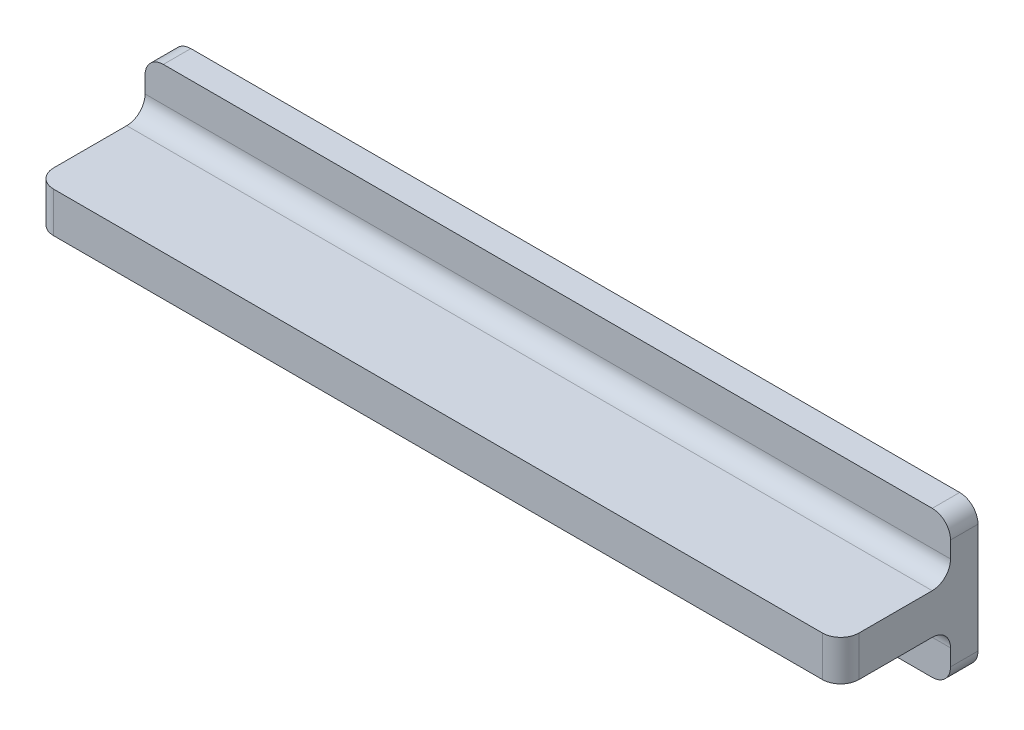
ISO-10303-21;
HEADER;
FILE_DESCRIPTION(('STEP AP214'),'2;1');
FILE_NAME('part.step','',(''),(''),'','','');
FILE_SCHEMA(('AUTOMOTIVE_DESIGN { 1 0 10303 214 1 1 1 1 }'));
ENDSEC;
DATA;
#1=APPLICATION_CONTEXT('core data for automotive mechanical design processes');
#2=APPLICATION_PROTOCOL_DEFINITION('international standard','automotive_design',2000,#1);
#3=PRODUCT_CONTEXT('',#1,'mechanical');
#4=PRODUCT('Part','Part','',(#3));
#5=PRODUCT_RELATED_PRODUCT_CATEGORY('part','',(#4));
#6=PRODUCT_DEFINITION_FORMATION('','',#4);
#7=PRODUCT_DEFINITION_CONTEXT('part definition',#1,'design');
#8=PRODUCT_DEFINITION('design','',#6,#7);
#9=PRODUCT_DEFINITION_SHAPE('','',#8);
#10=(LENGTH_UNIT() NAMED_UNIT(*) SI_UNIT(.MILLI.,.METRE.));
#11=(NAMED_UNIT(*) PLANE_ANGLE_UNIT() SI_UNIT($,.RADIAN.));
#12=(NAMED_UNIT(*) SI_UNIT($,.STERADIAN.) SOLID_ANGLE_UNIT());
#13=UNCERTAINTY_MEASURE_WITH_UNIT(LENGTH_MEASURE(1.E-05),#10,'distance_accuracy_value','');
#14=(GEOMETRIC_REPRESENTATION_CONTEXT(3) GLOBAL_UNCERTAINTY_ASSIGNED_CONTEXT((#13)) GLOBAL_UNIT_ASSIGNED_CONTEXT((#10,
#11,#12)) REPRESENTATION_CONTEXT('',''));
#15=CARTESIAN_POINT('',(0.,0.,0.));
#16=DIRECTION('',(0.,0.,1.));
#17=DIRECTION('',(1.,0.,0.));
#18=AXIS2_PLACEMENT_3D('',#15,#16,#17);
#19=CARTESIAN_POINT('',(0.,0.,4.7625));
#20=DIRECTION('',(0.,0.,1.));
#21=DIRECTION('',(1.,0.,0.));
#22=AXIS2_PLACEMENT_3D('',#19,#20,#21);
#23=PLANE('',#22);
#24=DIRECTION('',(0.,1.,0.));
#25=VECTOR('',#24,1.);
#26=CARTESIAN_POINT('',(69.85,12.7,4.7625));
#27=LINE('',#26,#25);
#28=CARTESIAN_POINT('',(69.85,-9.525,4.7625));
#29=VERTEX_POINT('',#28);
#30=CARTESIAN_POINT('',(69.85,-6.675,4.7625));
#31=VERTEX_POINT('',#30);
#32=EDGE_CURVE('E280',#29,#31,#27,.T.);
#33=ORIENTED_EDGE('',*,*,#32,.T.);
#34=DIRECTION('',(1.,0.,0.));
#35=VECTOR('',#34,1.);
#36=CARTESIAN_POINT('',(0.,-6.675,4.7625));
#37=LINE('',#36,#35);
#38=CARTESIAN_POINT('',(-69.85,-6.675,4.7625));
#39=VERTEX_POINT('',#38);
#40=EDGE_CURVE('E221',#31,#39,#37,.F.);
#41=ORIENTED_EDGE('',*,*,#40,.T.);
#42=DIRECTION('',(0.,-1.,0.));
#43=VECTOR('',#42,1.);
#44=CARTESIAN_POINT('',(-69.85,12.7,4.7625));
#45=LINE('',#44,#43);
#46=CARTESIAN_POINT('',(-69.85,-9.525,4.7625));
#47=VERTEX_POINT('',#46);
#48=EDGE_CURVE('E298',#39,#47,#45,.T.);
#49=ORIENTED_EDGE('',*,*,#48,.T.);
#50=CARTESIAN_POINT('',(-66.675,-9.525,4.7625));
#51=DIRECTION('',(0.,0.,1.));
#52=DIRECTION('',(1.,0.,0.));
#53=AXIS2_PLACEMENT_3D('',#50,#51,#52);
#54=CIRCLE('',#53,3.175);
#55=CARTESIAN_POINT('',(-66.675,-12.7,4.7625));
#56=VERTEX_POINT('',#55);
#57=EDGE_CURVE('E215',#47,#56,#54,.T.);
#58=ORIENTED_EDGE('',*,*,#57,.T.);
#59=DIRECTION('',(1.,0.,0.));
#60=VECTOR('',#59,1.);
#61=CARTESIAN_POINT('',(-69.85,-12.7,4.7625));
#62=LINE('',#61,#60);
#63=CARTESIAN_POINT('',(66.675,-12.7,4.7625));
#64=VERTEX_POINT('',#63);
#65=EDGE_CURVE('E193',#56,#64,#62,.T.);
#66=ORIENTED_EDGE('',*,*,#65,.T.);
#67=CARTESIAN_POINT('',(66.675,-9.525,4.7625));
#68=DIRECTION('',(0.,0.,1.));
#69=DIRECTION('',(1.,0.,0.));
#70=AXIS2_PLACEMENT_3D('',#67,#68,#69);
#71=CIRCLE('',#70,3.175);
#72=EDGE_CURVE('E218',#64,#29,#71,.T.);
#73=ORIENTED_EDGE('',*,*,#72,.T.);
#74=EDGE_LOOP('',(#33,#41,#49,#58,#66,#73));
#75=FACE_BOUND('',#74,.T.);
#76=ADVANCED_FACE('F42',(#75),#23,.T.);
#77=CARTESIAN_POINT('',(69.85,12.7,4.7625));
#78=DIRECTION('',(-1.,0.,0.));
#79=DIRECTION('',(0.,0.,1.));
#80=AXIS2_PLACEMENT_3D('',#77,#78,#79);
#81=PLANE('',#80);
#82=DIRECTION('',(0.,0.,-1.));
#83=VECTOR('',#82,1.);
#84=CARTESIAN_POINT('',(69.85,3.5,23.8125));
#85=LINE('',#84,#83);
#86=CARTESIAN_POINT('',(69.85,3.5,20.6375));
#87=VERTEX_POINT('',#86);
#88=CARTESIAN_POINT('',(69.85,3.5,7.93750000000001));
#89=VERTEX_POINT('',#88);
#90=EDGE_CURVE('E180',#87,#89,#85,.T.);
#91=ORIENTED_EDGE('',*,*,#90,.F.);
#92=DIRECTION('',(0.,1.,0.));
#93=VECTOR('',#92,1.);
#94=CARTESIAN_POINT('',(69.85,-3.5,20.6375));
#95=LINE('',#94,#93);
#96=CARTESIAN_POINT('',(69.85,-3.5,20.6375));
#97=VERTEX_POINT('',#96);
#98=EDGE_CURVE('E242',#87,#97,#95,.F.);
#99=ORIENTED_EDGE('',*,*,#98,.T.);
#100=DIRECTION('',(0.,0.,-1.));
#101=VECTOR('',#100,1.);
#102=CARTESIAN_POINT('',(69.85,-3.5,23.8125));
#103=LINE('',#102,#101);
#104=CARTESIAN_POINT('',(69.85,-3.5,7.93750000000001));
#105=VERTEX_POINT('',#104);
#106=EDGE_CURVE('E283',#97,#105,#103,.T.);
#107=ORIENTED_EDGE('',*,*,#106,.T.);
#108=CARTESIAN_POINT('',(69.85,-6.675,7.9375));
#109=DIRECTION('',(-1.,0.,0.));
#110=DIRECTION('',(0.,0.,1.));
#111=AXIS2_PLACEMENT_3D('',#108,#109,#110);
#112=CIRCLE('',#111,3.175);
#113=EDGE_CURVE('E51',#105,#31,#112,.T.);
#114=ORIENTED_EDGE('',*,*,#113,.T.);
#115=ORIENTED_EDGE('',*,*,#32,.F.);
#116=DIRECTION('',(0.,0.,-1.));
#117=VECTOR('',#116,1.);
#118=CARTESIAN_POINT('',(69.85,-9.525,4.7625));
#119=LINE('',#118,#117);
#120=CARTESIAN_POINT('',(69.85,-9.525,0.));
#121=VERTEX_POINT('',#120);
#122=EDGE_CURVE('E167',#29,#121,#119,.T.);
#123=ORIENTED_EDGE('',*,*,#122,.T.);
#124=DIRECTION('',(0.,1.,0.));
#125=VECTOR('',#124,1.);
#126=CARTESIAN_POINT('',(69.85,12.7,0.));
#127=LINE('',#126,#125);
#128=CARTESIAN_POINT('',(69.85,9.525,0.));
#129=VERTEX_POINT('',#128);
#130=EDGE_CURVE('E310',#121,#129,#127,.T.);
#131=ORIENTED_EDGE('',*,*,#130,.T.);
#132=DIRECTION('',(0.,0.,-1.));
#133=VECTOR('',#132,1.);
#134=CARTESIAN_POINT('',(69.85,9.525,4.7625));
#135=LINE('',#134,#133);
#136=CARTESIAN_POINT('',(69.85,9.525,4.7625));
#137=VERTEX_POINT('',#136);
#138=EDGE_CURVE('E239',#129,#137,#135,.F.);
#139=ORIENTED_EDGE('',*,*,#138,.T.);
#140=CARTESIAN_POINT('',(69.85,6.675,4.7625));
#141=VERTEX_POINT('',#140);
#142=EDGE_CURVE('E294',#141,#137,#27,.T.);
#143=ORIENTED_EDGE('',*,*,#142,.F.);
#144=CARTESIAN_POINT('',(69.85,6.675,7.9375));
#145=DIRECTION('',(-1.,0.,0.));
#146=DIRECTION('',(0.,0.,1.));
#147=AXIS2_PLACEMENT_3D('',#144,#145,#146);
#148=CIRCLE('',#147,3.175);
#149=EDGE_CURVE('E271',#141,#89,#148,.T.);
#150=ORIENTED_EDGE('',*,*,#149,.T.);
#151=EDGE_LOOP('',(#91,#99,#107,#114,#115,#123,#131,#139,#143,#150));
#152=FACE_BOUND('',#151,.T.);
#153=ADVANCED_FACE('F279',(#152),#81,.F.);
#154=CARTESIAN_POINT('',(-69.85,12.7,4.7625));
#155=DIRECTION('',(0.,-1.,0.));
#156=DIRECTION('',(0.,0.,-1.));
#157=AXIS2_PLACEMENT_3D('',#154,#155,#156);
#158=PLANE('',#157);
#159=DIRECTION('',(-1.,0.,0.));
#160=VECTOR('',#159,1.);
#161=CARTESIAN_POINT('',(-69.85,12.7,4.7625));
#162=LINE('',#161,#160);
#163=CARTESIAN_POINT('',(66.675,12.7,4.7625));
#164=VERTEX_POINT('',#163);
#165=CARTESIAN_POINT('',(-66.675,12.7,4.7625));
#166=VERTEX_POINT('',#165);
#167=EDGE_CURVE('E293',#164,#166,#162,.T.);
#168=ORIENTED_EDGE('',*,*,#167,.F.);
#169=DIRECTION('',(0.,0.,-1.));
#170=VECTOR('',#169,1.);
#171=CARTESIAN_POINT('',(66.675,12.7,4.7625));
#172=LINE('',#171,#170);
#173=CARTESIAN_POINT('',(66.675,12.7,0.));
#174=VERTEX_POINT('',#173);
#175=EDGE_CURVE('E248',#164,#174,#172,.T.);
#176=ORIENTED_EDGE('',*,*,#175,.T.);
#177=DIRECTION('',(-1.,0.,0.));
#178=VECTOR('',#177,1.);
#179=CARTESIAN_POINT('',(-69.85,12.7,0.));
#180=LINE('',#179,#178);
#181=CARTESIAN_POINT('',(-66.675,12.7,0.));
#182=VERTEX_POINT('',#181);
#183=EDGE_CURVE('E323',#174,#182,#180,.T.);
#184=ORIENTED_EDGE('',*,*,#183,.T.);
#185=DIRECTION('',(0.,0.,-1.));
#186=VECTOR('',#185,1.);
#187=CARTESIAN_POINT('',(-66.675,12.7,4.7625));
#188=LINE('',#187,#186);
#189=EDGE_CURVE('E245',#182,#166,#188,.F.);
#190=ORIENTED_EDGE('',*,*,#189,.T.);
#191=EDGE_LOOP('',(#168,#176,#184,#190));
#192=FACE_BOUND('',#191,.T.);
#193=ADVANCED_FACE('F350',(#192),#158,.F.);
#194=CARTESIAN_POINT('',(-69.85,12.7,4.7625));
#195=DIRECTION('',(1.,0.,0.));
#196=DIRECTION('',(0.,0.,-1.));
#197=AXIS2_PLACEMENT_3D('',#194,#195,#196);
#198=PLANE('',#197);
#199=DIRECTION('',(0.,0.,-1.));
#200=VECTOR('',#199,1.);
#201=CARTESIAN_POINT('',(-69.85,-3.5,23.8125));
#202=LINE('',#201,#200);
#203=CARTESIAN_POINT('',(-69.85,-3.5,20.6375));
#204=VERTEX_POINT('',#203);
#205=CARTESIAN_POINT('',(-69.85,-3.5,7.93750000000001));
#206=VERTEX_POINT('',#205);
#207=EDGE_CURVE('E163',#204,#206,#202,.T.);
#208=ORIENTED_EDGE('',*,*,#207,.F.);
#209=DIRECTION('',(0.,-1.,0.));
#210=VECTOR('',#209,1.);
#211=CARTESIAN_POINT('',(-69.85,3.5,20.6375));
#212=LINE('',#211,#210);
#213=CARTESIAN_POINT('',(-69.85,3.5,20.6375));
#214=VERTEX_POINT('',#213);
#215=EDGE_CURVE('E158',#204,#214,#212,.F.);
#216=ORIENTED_EDGE('',*,*,#215,.T.);
#217=DIRECTION('',(0.,0.,-1.));
#218=VECTOR('',#217,1.);
#219=CARTESIAN_POINT('',(-69.85,3.5,23.8125));
#220=LINE('',#219,#218);
#221=CARTESIAN_POINT('',(-69.85,3.5,7.93750000000001));
#222=VERTEX_POINT('',#221);
#223=EDGE_CURVE('E161',#214,#222,#220,.T.);
#224=ORIENTED_EDGE('',*,*,#223,.T.);
#225=CARTESIAN_POINT('',(-69.85,6.675,7.9375));
#226=DIRECTION('',(1.,0.,0.));
#227=DIRECTION('',(0.,0.,-1.));
#228=AXIS2_PLACEMENT_3D('',#225,#226,#227);
#229=CIRCLE('',#228,3.175);
#230=CARTESIAN_POINT('',(-69.85,6.675,4.7625));
#231=VERTEX_POINT('',#230);
#232=EDGE_CURVE('E268',#222,#231,#229,.T.);
#233=ORIENTED_EDGE('',*,*,#232,.T.);
#234=CARTESIAN_POINT('',(-69.85,9.525,4.7625));
#235=VERTEX_POINT('',#234);
#236=EDGE_CURVE('E317',#235,#231,#45,.T.);
#237=ORIENTED_EDGE('',*,*,#236,.F.);
#238=DIRECTION('',(0.,0.,-1.));
#239=VECTOR('',#238,1.);
#240=CARTESIAN_POINT('',(-69.85,9.525,4.7625));
#241=LINE('',#240,#239);
#242=CARTESIAN_POINT('',(-69.85,9.525,0.));
#243=VERTEX_POINT('',#242);
#244=EDGE_CURVE('E168',#235,#243,#241,.T.);
#245=ORIENTED_EDGE('',*,*,#244,.T.);
#246=DIRECTION('',(0.,-1.,0.));
#247=VECTOR('',#246,1.);
#248=CARTESIAN_POINT('',(-69.85,12.7,0.));
#249=LINE('',#248,#247);
#250=CARTESIAN_POINT('',(-69.85,-9.525,0.));
#251=VERTEX_POINT('',#250);
#252=EDGE_CURVE('E327',#243,#251,#249,.T.);
#253=ORIENTED_EDGE('',*,*,#252,.T.);
#254=DIRECTION('',(0.,0.,-1.));
#255=VECTOR('',#254,1.);
#256=CARTESIAN_POINT('',(-69.85,-9.525,4.7625));
#257=LINE('',#256,#255);
#258=EDGE_CURVE('E230',#251,#47,#257,.F.);
#259=ORIENTED_EDGE('',*,*,#258,.T.);
#260=ORIENTED_EDGE('',*,*,#48,.F.);
#261=CARTESIAN_POINT('',(-69.85,-6.675,7.9375));
#262=DIRECTION('',(1.,0.,0.));
#263=DIRECTION('',(0.,0.,-1.));
#264=AXIS2_PLACEMENT_3D('',#261,#262,#263);
#265=CIRCLE('',#264,3.175);
#266=EDGE_CURVE('E11',#39,#206,#265,.T.);
#267=ORIENTED_EDGE('',*,*,#266,.T.);
#268=EDGE_LOOP('',(#208,#216,#224,#233,#237,#245,#253,#259,#260,#267));
#269=FACE_BOUND('',#268,.T.);
#270=ADVANCED_FACE('F160',(#269),#198,.F.);
#271=CARTESIAN_POINT('',(-69.85,-12.7,4.7625));
#272=DIRECTION('',(0.,1.,0.));
#273=DIRECTION('',(0.,0.,1.));
#274=AXIS2_PLACEMENT_3D('',#271,#272,#273);
#275=PLANE('',#274);
#276=DIRECTION('',(1.,0.,0.));
#277=VECTOR('',#276,1.);
#278=CARTESIAN_POINT('',(-69.85,-12.7,0.));
#279=LINE('',#278,#277);
#280=CARTESIAN_POINT('',(-66.675,-12.7,0.));
#281=VERTEX_POINT('',#280);
#282=CARTESIAN_POINT('',(66.675,-12.7,0.));
#283=VERTEX_POINT('',#282);
#284=EDGE_CURVE('E330',#281,#283,#279,.T.);
#285=ORIENTED_EDGE('',*,*,#284,.T.);
#286=DIRECTION('',(0.,0.,-1.));
#287=VECTOR('',#286,1.);
#288=CARTESIAN_POINT('',(66.675,-12.7,4.7625));
#289=LINE('',#288,#287);
#290=EDGE_CURVE('E265',#283,#64,#289,.F.);
#291=ORIENTED_EDGE('',*,*,#290,.T.);
#292=ORIENTED_EDGE('',*,*,#65,.F.);
#293=DIRECTION('',(0.,0.,-1.));
#294=VECTOR('',#293,1.);
#295=CARTESIAN_POINT('',(-66.675,-12.7,4.7625));
#296=LINE('',#295,#294);
#297=EDGE_CURVE('E262',#56,#281,#296,.T.);
#298=ORIENTED_EDGE('',*,*,#297,.T.);
#299=EDGE_LOOP('',(#285,#291,#292,#298));
#300=FACE_BOUND('',#299,.T.);
#301=ADVANCED_FACE('F391',(#300),#275,.F.);
#302=ORIENTED_EDGE('',*,*,#236,.T.);
#303=DIRECTION('',(-1.,0.,0.));
#304=VECTOR('',#303,1.);
#305=CARTESIAN_POINT('',(0.,6.675,4.7625));
#306=LINE('',#305,#304);
#307=EDGE_CURVE('E202',#231,#141,#306,.F.);
#308=ORIENTED_EDGE('',*,*,#307,.T.);
#309=ORIENTED_EDGE('',*,*,#142,.T.);
#310=CARTESIAN_POINT('',(66.675,9.525,4.7625));
#311=DIRECTION('',(0.,0.,1.));
#312=DIRECTION('',(1.,0.,0.));
#313=AXIS2_PLACEMENT_3D('',#310,#311,#312);
#314=CIRCLE('',#313,3.175);
#315=EDGE_CURVE('E199',#137,#164,#314,.T.);
#316=ORIENTED_EDGE('',*,*,#315,.T.);
#317=ORIENTED_EDGE('',*,*,#167,.T.);
#318=CARTESIAN_POINT('',(-66.675,9.525,4.7625));
#319=DIRECTION('',(0.,0.,1.));
#320=DIRECTION('',(1.,0.,0.));
#321=AXIS2_PLACEMENT_3D('',#318,#319,#320);
#322=CIRCLE('',#321,3.175);
#323=EDGE_CURVE('E191',#166,#235,#322,.T.);
#324=ORIENTED_EDGE('',*,*,#323,.T.);
#325=EDGE_LOOP('',(#302,#308,#309,#316,#317,#324));
#326=FACE_BOUND('',#325,.T.);
#327=ADVANCED_FACE('F340',(#326),#23,.T.);
#328=CARTESIAN_POINT('',(0.,0.,0.));
#329=DIRECTION('',(0.,0.,1.));
#330=DIRECTION('',(1.,0.,0.));
#331=AXIS2_PLACEMENT_3D('',#328,#329,#330);
#332=PLANE('',#331);
#333=ORIENTED_EDGE('',*,*,#183,.F.);
#334=CARTESIAN_POINT('',(66.675,9.525,0.));
#335=DIRECTION('',(0.,0.,1.));
#336=DIRECTION('',(1.,0.,0.));
#337=AXIS2_PLACEMENT_3D('',#334,#335,#336);
#338=CIRCLE('',#337,3.175);
#339=EDGE_CURVE('E259',#174,#129,#338,.F.);
#340=ORIENTED_EDGE('',*,*,#339,.T.);
#341=ORIENTED_EDGE('',*,*,#130,.F.);
#342=CARTESIAN_POINT('',(66.675,-9.525,0.));
#343=DIRECTION('',(0.,0.,1.));
#344=DIRECTION('',(1.,0.,0.));
#345=AXIS2_PLACEMENT_3D('',#342,#343,#344);
#346=CIRCLE('',#345,3.175);
#347=EDGE_CURVE('E58',#121,#283,#346,.F.);
#348=ORIENTED_EDGE('',*,*,#347,.T.);
#349=ORIENTED_EDGE('',*,*,#284,.F.);
#350=CARTESIAN_POINT('',(-66.675,-9.525,0.));
#351=DIRECTION('',(0.,0.,1.));
#352=DIRECTION('',(1.,0.,0.));
#353=AXIS2_PLACEMENT_3D('',#350,#351,#352);
#354=CIRCLE('',#353,3.175);
#355=EDGE_CURVE('E66',#281,#251,#354,.F.);
#356=ORIENTED_EDGE('',*,*,#355,.T.);
#357=ORIENTED_EDGE('',*,*,#252,.F.);
#358=CARTESIAN_POINT('',(-66.675,9.525,0.));
#359=DIRECTION('',(0.,0.,1.));
#360=DIRECTION('',(1.,0.,0.));
#361=AXIS2_PLACEMENT_3D('',#358,#359,#360);
#362=CIRCLE('',#361,3.175);
#363=EDGE_CURVE('E254',#243,#182,#362,.F.);
#364=ORIENTED_EDGE('',*,*,#363,.T.);
#365=EDGE_LOOP('',(#333,#340,#341,#348,#349,#356,#357,#364));
#366=FACE_BOUND('',#365,.T.);
#367=ADVANCED_FACE('F352',(#366),#332,.F.);
#368=CARTESIAN_POINT('',(-69.85,3.5,23.8125));
#369=DIRECTION('',(0.,-1.,0.));
#370=DIRECTION('',(0.,0.,-1.));
#371=AXIS2_PLACEMENT_3D('',#368,#369,#370);
#372=PLANE('',#371);
#373=ORIENTED_EDGE('',*,*,#90,.T.);
#374=DIRECTION('',(-1.,0.,0.));
#375=VECTOR('',#374,1.);
#376=CARTESIAN_POINT('',(-69.85,3.5,7.9375));
#377=LINE('',#376,#375);
#378=EDGE_CURVE('E178',#89,#222,#377,.T.);
#379=ORIENTED_EDGE('',*,*,#378,.T.);
#380=ORIENTED_EDGE('',*,*,#223,.F.);
#381=CARTESIAN_POINT('',(-66.675,3.5,20.6375));
#382=DIRECTION('',(0.,-1.,0.));
#383=DIRECTION('',(0.,0.,-1.));
#384=AXIS2_PLACEMENT_3D('',#381,#382,#383);
#385=CIRCLE('',#384,3.175);
#386=CARTESIAN_POINT('',(-66.675,3.5,23.8125));
#387=VERTEX_POINT('',#386);
#388=EDGE_CURVE('E175',#214,#387,#385,.F.);
#389=ORIENTED_EDGE('',*,*,#388,.T.);
#390=DIRECTION('',(-1.,0.,0.));
#391=VECTOR('',#390,1.);
#392=CARTESIAN_POINT('',(-69.85,3.5,23.8125));
#393=LINE('',#392,#391);
#394=CARTESIAN_POINT('',(66.675,3.5,23.8125));
#395=VERTEX_POINT('',#394);
#396=EDGE_CURVE('E363',#395,#387,#393,.T.);
#397=ORIENTED_EDGE('',*,*,#396,.F.);
#398=CARTESIAN_POINT('',(66.675,3.5,20.6375));
#399=DIRECTION('',(0.,-1.,0.));
#400=DIRECTION('',(0.,0.,-1.));
#401=AXIS2_PLACEMENT_3D('',#398,#399,#400);
#402=CIRCLE('',#401,3.175);
#403=EDGE_CURVE('E187',#395,#87,#402,.F.);
#404=ORIENTED_EDGE('',*,*,#403,.T.);
#405=EDGE_LOOP('',(#373,#379,#380,#389,#397,#404));
#406=FACE_BOUND('',#405,.T.);
#407=ADVANCED_FACE('F173',(#406),#372,.F.);
#408=CARTESIAN_POINT('',(-69.85,-3.5,23.8125));
#409=DIRECTION('',(0.,1.,0.));
#410=DIRECTION('',(0.,0.,1.));
#411=AXIS2_PLACEMENT_3D('',#408,#409,#410);
#412=PLANE('',#411);
#413=ORIENTED_EDGE('',*,*,#207,.T.);
#414=DIRECTION('',(1.,0.,0.));
#415=VECTOR('',#414,1.);
#416=CARTESIAN_POINT('',(-69.85,-3.5,7.9375));
#417=LINE('',#416,#415);
#418=EDGE_CURVE('E211',#206,#105,#417,.T.);
#419=ORIENTED_EDGE('',*,*,#418,.T.);
#420=ORIENTED_EDGE('',*,*,#106,.F.);
#421=CARTESIAN_POINT('',(66.675,-3.5,20.6375));
#422=DIRECTION('',(0.,1.,0.));
#423=DIRECTION('',(0.,0.,1.));
#424=AXIS2_PLACEMENT_3D('',#421,#422,#423);
#425=CIRCLE('',#424,3.175);
#426=CARTESIAN_POINT('',(66.675,-3.5,23.8125));
#427=VERTEX_POINT('',#426);
#428=EDGE_CURVE('E205',#97,#427,#425,.F.);
#429=ORIENTED_EDGE('',*,*,#428,.T.);
#430=DIRECTION('',(1.,0.,0.));
#431=VECTOR('',#430,1.);
#432=CARTESIAN_POINT('',(-69.85,-3.5,23.8125));
#433=LINE('',#432,#431);
#434=CARTESIAN_POINT('',(-66.675,-3.5,23.8125));
#435=VERTEX_POINT('',#434);
#436=EDGE_CURVE('E305',#435,#427,#433,.T.);
#437=ORIENTED_EDGE('',*,*,#436,.F.);
#438=CARTESIAN_POINT('',(-66.675,-3.5,20.6375));
#439=DIRECTION('',(0.,1.,0.));
#440=DIRECTION('',(0.,0.,1.));
#441=AXIS2_PLACEMENT_3D('',#438,#439,#440);
#442=CIRCLE('',#441,3.175);
#443=EDGE_CURVE('E208',#435,#204,#442,.F.);
#444=ORIENTED_EDGE('',*,*,#443,.T.);
#445=EDGE_LOOP('',(#413,#419,#420,#429,#437,#444));
#446=FACE_BOUND('',#445,.T.);
#447=ADVANCED_FACE('F300',(#446),#412,.F.);
#448=CARTESIAN_POINT('',(0.,0.,23.8125));
#449=DIRECTION('',(0.,0.,1.));
#450=DIRECTION('',(1.,0.,0.));
#451=AXIS2_PLACEMENT_3D('',#448,#449,#450);
#452=PLANE('',#451);
#453=ORIENTED_EDGE('',*,*,#396,.T.);
#454=DIRECTION('',(0.,-1.,0.));
#455=VECTOR('',#454,1.);
#456=CARTESIAN_POINT('',(-66.675,-3.5,23.8125));
#457=LINE('',#456,#455);
#458=EDGE_CURVE('E185',#387,#435,#457,.T.);
#459=ORIENTED_EDGE('',*,*,#458,.T.);
#460=ORIENTED_EDGE('',*,*,#436,.T.);
#461=DIRECTION('',(0.,1.,0.));
#462=VECTOR('',#461,1.);
#463=CARTESIAN_POINT('',(66.675,3.5,23.8125));
#464=LINE('',#463,#462);
#465=EDGE_CURVE('E224',#427,#395,#464,.T.);
#466=ORIENTED_EDGE('',*,*,#465,.T.);
#467=EDGE_LOOP('',(#453,#459,#460,#466));
#468=FACE_BOUND('',#467,.T.);
#469=ADVANCED_FACE('F370',(#468),#452,.T.);
#470=CARTESIAN_POINT('',(-69.85,6.675,7.9375));
#471=DIRECTION('',(-1.,0.,0.));
#472=DIRECTION('',(0.,0.,1.));
#473=AXIS2_PLACEMENT_3D('',#470,#471,#472);
#474=CYLINDRICAL_SURFACE('',#473,3.175);
#475=ORIENTED_EDGE('',*,*,#149,.F.);
#476=ORIENTED_EDGE('',*,*,#307,.F.);
#477=ORIENTED_EDGE('',*,*,#232,.F.);
#478=ORIENTED_EDGE('',*,*,#378,.F.);
#479=EDGE_LOOP('',(#475,#476,#477,#478));
#480=FACE_BOUND('',#479,.T.);
#481=ADVANCED_FACE('F361',(#480),#474,.F.);
#482=CARTESIAN_POINT('',(-69.85,-6.675,7.9375));
#483=DIRECTION('',(1.,0.,0.));
#484=DIRECTION('',(0.,0.,-1.));
#485=AXIS2_PLACEMENT_3D('',#482,#483,#484);
#486=CYLINDRICAL_SURFACE('',#485,3.175);
#487=ORIENTED_EDGE('',*,*,#266,.F.);
#488=ORIENTED_EDGE('',*,*,#40,.F.);
#489=ORIENTED_EDGE('',*,*,#113,.F.);
#490=ORIENTED_EDGE('',*,*,#418,.F.);
#491=EDGE_LOOP('',(#487,#488,#489,#490));
#492=FACE_BOUND('',#491,.T.);
#493=ADVANCED_FACE('F297',(#492),#486,.F.);
#494=CARTESIAN_POINT('',(-66.675,0.,20.6375));
#495=DIRECTION('',(0.,1.,0.));
#496=DIRECTION('',(0.,0.,1.));
#497=AXIS2_PLACEMENT_3D('',#494,#495,#496);
#498=CYLINDRICAL_SURFACE('',#497,3.175);
#499=ORIENTED_EDGE('',*,*,#388,.F.);
#500=ORIENTED_EDGE('',*,*,#215,.F.);
#501=ORIENTED_EDGE('',*,*,#443,.F.);
#502=ORIENTED_EDGE('',*,*,#458,.F.);
#503=EDGE_LOOP('',(#499,#500,#501,#502));
#504=FACE_BOUND('',#503,.T.);
#505=ADVANCED_FACE('F183',(#504),#498,.T.);
#506=CARTESIAN_POINT('',(66.675,0.,20.6375));
#507=DIRECTION('',(0.,-1.,0.));
#508=DIRECTION('',(0.,0.,-1.));
#509=AXIS2_PLACEMENT_3D('',#506,#507,#508);
#510=CYLINDRICAL_SURFACE('',#509,3.175);
#511=ORIENTED_EDGE('',*,*,#428,.F.);
#512=ORIENTED_EDGE('',*,*,#98,.F.);
#513=ORIENTED_EDGE('',*,*,#403,.F.);
#514=ORIENTED_EDGE('',*,*,#465,.F.);
#515=EDGE_LOOP('',(#511,#512,#513,#514));
#516=FACE_BOUND('',#515,.T.);
#517=ADVANCED_FACE('F367',(#516),#510,.T.);
#518=CARTESIAN_POINT('',(66.675,9.525,4.7625));
#519=DIRECTION('',(0.,0.,-1.));
#520=DIRECTION('',(-1.,0.,0.));
#521=AXIS2_PLACEMENT_3D('',#518,#519,#520);
#522=CYLINDRICAL_SURFACE('',#521,3.175);
#523=ORIENTED_EDGE('',*,*,#315,.F.);
#524=ORIENTED_EDGE('',*,*,#138,.F.);
#525=ORIENTED_EDGE('',*,*,#339,.F.);
#526=ORIENTED_EDGE('',*,*,#175,.F.);
#527=EDGE_LOOP('',(#523,#524,#525,#526));
#528=FACE_BOUND('',#527,.T.);
#529=ADVANCED_FACE('F347',(#528),#522,.T.);
#530=CARTESIAN_POINT('',(66.675,-9.525,4.7625));
#531=DIRECTION('',(0.,0.,-1.));
#532=DIRECTION('',(-1.,0.,0.));
#533=AXIS2_PLACEMENT_3D('',#530,#531,#532);
#534=CYLINDRICAL_SURFACE('',#533,3.175);
#535=ORIENTED_EDGE('',*,*,#72,.F.);
#536=ORIENTED_EDGE('',*,*,#290,.F.);
#537=ORIENTED_EDGE('',*,*,#347,.F.);
#538=ORIENTED_EDGE('',*,*,#122,.F.);
#539=EDGE_LOOP('',(#535,#536,#537,#538));
#540=FACE_BOUND('',#539,.T.);
#541=ADVANCED_FACE('F412',(#540),#534,.T.);
#542=CARTESIAN_POINT('',(-66.675,9.525,4.7625));
#543=DIRECTION('',(0.,0.,-1.));
#544=DIRECTION('',(-1.,0.,0.));
#545=AXIS2_PLACEMENT_3D('',#542,#543,#544);
#546=CYLINDRICAL_SURFACE('',#545,3.175);
#547=ORIENTED_EDGE('',*,*,#323,.F.);
#548=ORIENTED_EDGE('',*,*,#189,.F.);
#549=ORIENTED_EDGE('',*,*,#363,.F.);
#550=ORIENTED_EDGE('',*,*,#244,.F.);
#551=EDGE_LOOP('',(#547,#548,#549,#550));
#552=FACE_BOUND('',#551,.T.);
#553=ADVANCED_FACE('F357',(#552),#546,.T.);
#554=CARTESIAN_POINT('',(-66.675,-9.525,4.7625));
#555=DIRECTION('',(0.,0.,-1.));
#556=DIRECTION('',(-1.,0.,0.));
#557=AXIS2_PLACEMENT_3D('',#554,#555,#556);
#558=CYLINDRICAL_SURFACE('',#557,3.175);
#559=ORIENTED_EDGE('',*,*,#57,.F.);
#560=ORIENTED_EDGE('',*,*,#258,.F.);
#561=ORIENTED_EDGE('',*,*,#355,.F.);
#562=ORIENTED_EDGE('',*,*,#297,.F.);
#563=EDGE_LOOP('',(#559,#560,#561,#562));
#564=FACE_BOUND('',#563,.T.);
#565=ADVANCED_FACE('F44',(#564),#558,.T.);
#566=CLOSED_SHELL('',(#76,#153,#193,#270,#301,#327,#367,#407,#447,#469,#481,#493,#505,#517,#529,
#541,#553,#565));
#567=MANIFOLD_SOLID_BREP('B2',#566);
#568=ADVANCED_BREP_SHAPE_REPRESENTATION('',(#18,#567),#14);
#569=SHAPE_DEFINITION_REPRESENTATION(#9,#568);
ENDSEC;
END-ISO-10303-21;
